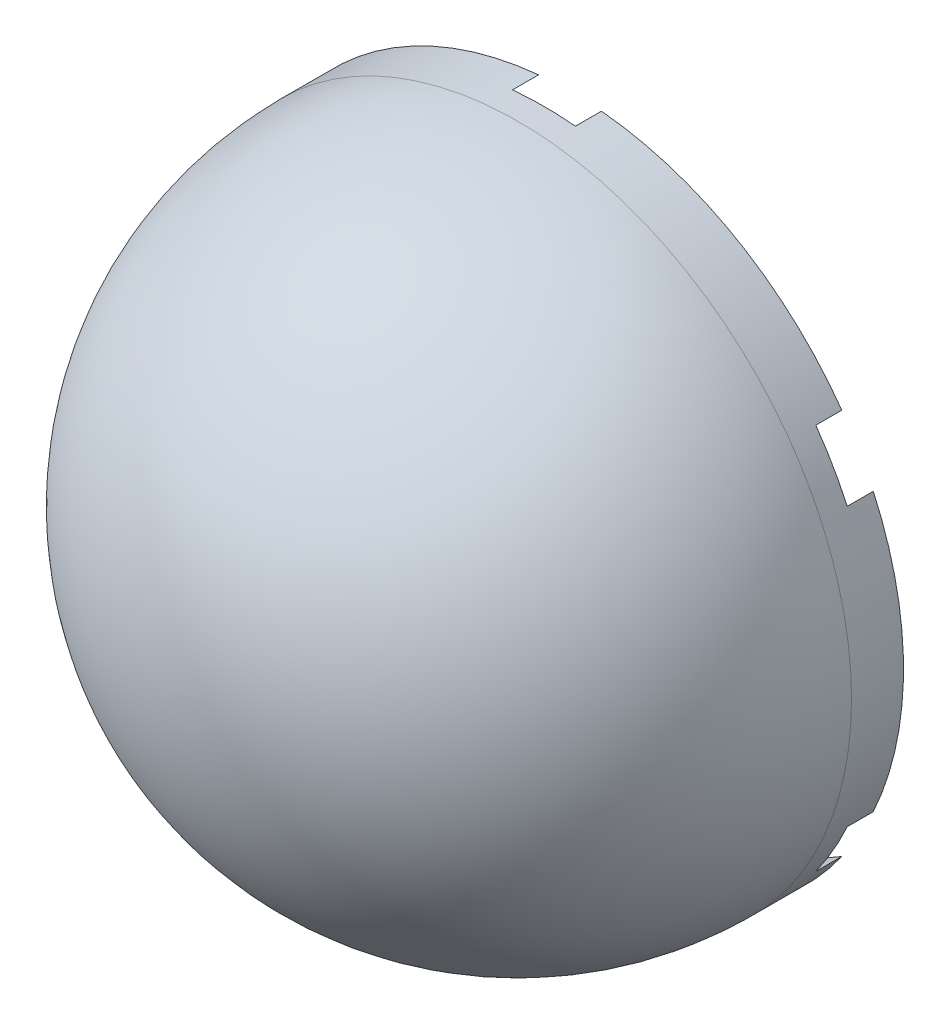
ISO-10303-21;
HEADER;
FILE_DESCRIPTION(('STEP AP214'),'2;1');
FILE_NAME('part.step','',(''),(''),'','','');
FILE_SCHEMA(('AUTOMOTIVE_DESIGN { 1 0 10303 214 1 1 1 1 }'));
ENDSEC;
DATA;
#1=APPLICATION_CONTEXT('core data for automotive mechanical design processes');
#2=APPLICATION_PROTOCOL_DEFINITION('international standard','automotive_design',2000,#1);
#3=PRODUCT_CONTEXT('',#1,'mechanical');
#4=PRODUCT('Part','Part','',(#3));
#5=PRODUCT_RELATED_PRODUCT_CATEGORY('part','',(#4));
#6=PRODUCT_DEFINITION_FORMATION('','',#4);
#7=PRODUCT_DEFINITION_CONTEXT('part definition',#1,'design');
#8=PRODUCT_DEFINITION('design','',#6,#7);
#9=PRODUCT_DEFINITION_SHAPE('','',#8);
#10=(LENGTH_UNIT() NAMED_UNIT(*) SI_UNIT(.MILLI.,.METRE.));
#11=(NAMED_UNIT(*) PLANE_ANGLE_UNIT() SI_UNIT($,.RADIAN.));
#12=(NAMED_UNIT(*) SI_UNIT($,.STERADIAN.) SOLID_ANGLE_UNIT());
#13=UNCERTAINTY_MEASURE_WITH_UNIT(LENGTH_MEASURE(1.E-05),#10,'distance_accuracy_value','');
#14=(GEOMETRIC_REPRESENTATION_CONTEXT(3) GLOBAL_UNCERTAINTY_ASSIGNED_CONTEXT((#13)) GLOBAL_UNIT_ASSIGNED_CONTEXT((#10,
#11,#12)) REPRESENTATION_CONTEXT('',''));
#15=CARTESIAN_POINT('',(0.,0.,0.));
#16=DIRECTION('',(0.,0.,1.));
#17=DIRECTION('',(1.,0.,0.));
#18=AXIS2_PLACEMENT_3D('',#15,#16,#17);
#19=CARTESIAN_POINT('',(-69.634967563167,5.39430382459221,48.6));
#20=DIRECTION('',(0.,0.,1.));
#21=DIRECTION('',(1.,0.,0.));
#22=AXIS2_PLACEMENT_3D('',#19,#20,#21);
#23=PLANE('',#22);
#24=CARTESIAN_POINT('',(-69.634967563167,5.39430382459221,48.6));
#25=DIRECTION('',(0.,0.,1.));
#26=DIRECTION('',(1.,0.,0.));
#27=AXIS2_PLACEMENT_3D('',#24,#25,#26);
#28=CIRCLE('',#27,11.5470053837925);
#29=CARTESIAN_POINT('',(-70.7241383188938,16.8898264485621,48.6));
#30=VERTEX_POINT('',#29);
#31=CARTESIAN_POINT('',(-79.0457968074403,12.0853146800956,48.6));
#32=VERTEX_POINT('',#31);
#33=EDGE_CURVE('E133',#30,#32,#28,.T.);
#34=ORIENTED_EDGE('',*,*,#33,.F.);
#35=DIRECTION('',(0.866025403784439,0.499999999999999,0.));
#36=VECTOR('',#35,1.);
#37=CARTESIAN_POINT('',(-80.134967563167,11.4564816510833,48.6));
#38=LINE('',#37,#36);
#39=EDGE_CURVE('E124',#32,#30,#38,.T.);
#40=ORIENTED_EDGE('',*,*,#39,.F.);
#41=EDGE_LOOP('',(#34,#40));
#42=FACE_BOUND('',#41,.T.);
#43=ADVANCED_FACE('F33',(#42),#23,.F.);
#44=CARTESIAN_POINT('',(-80.134967563167,10.1988155930587,48.6));
#45=VERTEX_POINT('',#44);
#46=CARTESIAN_POINT('',(-80.134967563167,0.589792056125666,48.6));
#47=VERTEX_POINT('',#46);
#48=EDGE_CURVE('E140',#45,#47,#28,.T.);
#49=ORIENTED_EDGE('',*,*,#48,.F.);
#50=DIRECTION('',(0.,1.,0.));
#51=VECTOR('',#50,1.);
#52=CARTESIAN_POINT('',(-80.134967563167,-0.66787400189888,48.6));
#53=LINE('',#52,#51);
#54=EDGE_CURVE('E215',#47,#45,#53,.T.);
#55=ORIENTED_EDGE('',*,*,#54,.F.);
#56=EDGE_LOOP('',(#49,#55));
#57=FACE_BOUND('',#56,.T.);
#58=ADVANCED_FACE('F244',(#57),#23,.F.);
#59=CARTESIAN_POINT('',(-79.0457968074403,-1.29670703091116,48.6));
#60=VERTEX_POINT('',#59);
#61=CARTESIAN_POINT('',(-70.7241383188937,-6.10121879937765,48.6));
#62=VERTEX_POINT('',#61);
#63=EDGE_CURVE('E146',#60,#62,#28,.T.);
#64=ORIENTED_EDGE('',*,*,#63,.F.);
#65=DIRECTION('',(-0.866025403784439,0.5,0.));
#66=VECTOR('',#65,1.);
#67=CARTESIAN_POINT('',(-69.634967563167,-6.73005182838994,48.6));
#68=LINE('',#67,#66);
#69=EDGE_CURVE('E212',#62,#60,#68,.T.);
#70=ORIENTED_EDGE('',*,*,#69,.F.);
#71=EDGE_LOOP('',(#64,#70));
#72=FACE_BOUND('',#71,.T.);
#73=ADVANCED_FACE('F249',(#72),#23,.F.);
#74=CARTESIAN_POINT('',(-68.5457968074403,-6.10121879937765,48.6));
#75=VERTEX_POINT('',#74);
#76=CARTESIAN_POINT('',(-60.2241383188938,-1.29670703091118,48.6));
#77=VERTEX_POINT('',#76);
#78=EDGE_CURVE('E150',#75,#77,#28,.T.);
#79=ORIENTED_EDGE('',*,*,#78,.F.);
#80=DIRECTION('',(-0.866025403784439,-0.5,0.));
#81=VECTOR('',#80,1.);
#82=CARTESIAN_POINT('',(-59.134967563167,-0.667874001898872,48.6));
#83=LINE('',#82,#81);
#84=EDGE_CURVE('E210',#77,#75,#83,.T.);
#85=ORIENTED_EDGE('',*,*,#84,.F.);
#86=EDGE_LOOP('',(#79,#85));
#87=FACE_BOUND('',#86,.T.);
#88=ADVANCED_FACE('F209',(#87),#23,.F.);
#89=CARTESIAN_POINT('',(-59.134967563167,0.589792056125739,48.6));
#90=VERTEX_POINT('',#89);
#91=CARTESIAN_POINT('',(-59.134967563167,10.1988155930587,48.6));
#92=VERTEX_POINT('',#91);
#93=EDGE_CURVE('E144',#90,#92,#28,.T.);
#94=ORIENTED_EDGE('',*,*,#93,.F.);
#95=DIRECTION('',(0.,-1.,0.));
#96=VECTOR('',#95,1.);
#97=CARTESIAN_POINT('',(-59.134967563167,11.4564816510833,48.6));
#98=LINE('',#97,#96);
#99=EDGE_CURVE('E213',#92,#90,#98,.T.);
#100=ORIENTED_EDGE('',*,*,#99,.F.);
#101=EDGE_LOOP('',(#94,#100));
#102=FACE_BOUND('',#101,.T.);
#103=ADVANCED_FACE('F234',(#102),#23,.F.);
#104=CARTESIAN_POINT('',(-60.2241383188938,12.0853146800956,48.6));
#105=VERTEX_POINT('',#104);
#106=CARTESIAN_POINT('',(-68.5457968074403,16.8898264485621,48.6));
#107=VERTEX_POINT('',#106);
#108=EDGE_CURVE('E139',#105,#107,#28,.T.);
#109=ORIENTED_EDGE('',*,*,#108,.F.);
#110=DIRECTION('',(0.866025403784439,-0.5,0.));
#111=VECTOR('',#110,1.);
#112=CARTESIAN_POINT('',(-69.634967563167,17.5186594775744,48.6));
#113=LINE('',#112,#111);
#114=EDGE_CURVE('E134',#107,#105,#113,.T.);
#115=ORIENTED_EDGE('',*,*,#114,.F.);
#116=EDGE_LOOP('',(#109,#115));
#117=FACE_BOUND('',#116,.T.);
#118=ADVANCED_FACE('F232',(#117),#23,.F.);
#119=CARTESIAN_POINT('',(-69.634967563167,5.39430382459221,50.4));
#120=DIRECTION('',(0.,0.,-1.));
#121=DIRECTION('',(-1.,0.,0.));
#122=AXIS2_PLACEMENT_3D('',#119,#120,#121);
#123=CYLINDRICAL_SURFACE('',#122,11.5470053837925);
#124=ORIENTED_EDGE('',*,*,#33,.T.);
#125=DIRECTION('',(0.,0.,-1.));
#126=VECTOR('',#125,1.);
#127=CARTESIAN_POINT('',(-79.0457968074403,12.0853146800956,50.4));
#128=LINE('',#127,#126);
#129=CARTESIAN_POINT('',(-79.0457968074403,12.0853146800956,49.5));
#130=VERTEX_POINT('',#129);
#131=EDGE_CURVE('E11',#32,#130,#128,.F.);
#132=ORIENTED_EDGE('',*,*,#131,.T.);
#133=CARTESIAN_POINT('',(-69.634967563167,5.39430382459221,49.5));
#134=DIRECTION('',(0.,0.,-1.));
#135=DIRECTION('',(-1.,0.,0.));
#136=AXIS2_PLACEMENT_3D('',#133,#134,#135);
#137=CIRCLE('',#136,11.5470053837925);
#138=CARTESIAN_POINT('',(-80.134967563167,10.1988155930587,49.5));
#139=VERTEX_POINT('',#138);
#140=EDGE_CURVE('E156',#139,#130,#137,.T.);
#141=ORIENTED_EDGE('',*,*,#140,.F.);
#142=DIRECTION('',(0.,0.,-1.));
#143=VECTOR('',#142,1.);
#144=CARTESIAN_POINT('',(-80.134967563167,10.1988155930587,50.4));
#145=LINE('',#144,#143);
#146=EDGE_CURVE('E41',#139,#45,#145,.T.);
#147=ORIENTED_EDGE('',*,*,#146,.T.);
#148=ORIENTED_EDGE('',*,*,#48,.T.);
#149=DIRECTION('',(0.,0.,-1.));
#150=VECTOR('',#149,1.);
#151=CARTESIAN_POINT('',(-80.134967563167,0.589792056125684,50.4));
#152=LINE('',#151,#150);
#153=CARTESIAN_POINT('',(-80.134967563167,0.589792056125666,49.5));
#154=VERTEX_POINT('',#153);
#155=EDGE_CURVE('E160',#47,#154,#152,.F.);
#156=ORIENTED_EDGE('',*,*,#155,.T.);
#157=CARTESIAN_POINT('',(-79.0457968074403,-1.29670703091116,49.5));
#158=VERTEX_POINT('',#157);
#159=EDGE_CURVE('E153',#158,#154,#137,.T.);
#160=ORIENTED_EDGE('',*,*,#159,.F.);
#161=DIRECTION('',(0.,0.,-1.));
#162=VECTOR('',#161,1.);
#163=CARTESIAN_POINT('',(-79.0457968074403,-1.29670703091117,50.4));
#164=LINE('',#163,#162);
#165=EDGE_CURVE('E155',#158,#60,#164,.T.);
#166=ORIENTED_EDGE('',*,*,#165,.T.);
#167=ORIENTED_EDGE('',*,*,#63,.T.);
#168=DIRECTION('',(0.,0.,-1.));
#169=VECTOR('',#168,1.);
#170=CARTESIAN_POINT('',(-70.7241383188938,-6.10121879937765,50.4));
#171=LINE('',#170,#169);
#172=CARTESIAN_POINT('',(-70.7241383188937,-6.10121879937765,49.5));
#173=VERTEX_POINT('',#172);
#174=EDGE_CURVE('E166',#62,#173,#171,.F.);
#175=ORIENTED_EDGE('',*,*,#174,.T.);
#176=CARTESIAN_POINT('',(-68.5457968074403,-6.10121879937765,49.5));
#177=VERTEX_POINT('',#176);
#178=EDGE_CURVE('E157',#177,#173,#137,.T.);
#179=ORIENTED_EDGE('',*,*,#178,.F.);
#180=DIRECTION('',(0.,0.,-1.));
#181=VECTOR('',#180,1.);
#182=CARTESIAN_POINT('',(-68.5457968074403,-6.10121879937765,50.4));
#183=LINE('',#182,#181);
#184=EDGE_CURVE('E163',#177,#75,#183,.T.);
#185=ORIENTED_EDGE('',*,*,#184,.T.);
#186=ORIENTED_EDGE('',*,*,#78,.T.);
#187=DIRECTION('',(0.,0.,-1.));
#188=VECTOR('',#187,1.);
#189=CARTESIAN_POINT('',(-60.2241383188938,-1.29670703091117,50.4));
#190=LINE('',#189,#188);
#191=CARTESIAN_POINT('',(-60.2241383188938,-1.29670703091118,49.5));
#192=VERTEX_POINT('',#191);
#193=EDGE_CURVE('E173',#77,#192,#190,.F.);
#194=ORIENTED_EDGE('',*,*,#193,.T.);
#195=CARTESIAN_POINT('',(-59.134967563167,0.589792056125739,49.5));
#196=VERTEX_POINT('',#195);
#197=EDGE_CURVE('E169',#196,#192,#137,.T.);
#198=ORIENTED_EDGE('',*,*,#197,.F.);
#199=DIRECTION('',(0.,0.,-1.));
#200=VECTOR('',#199,1.);
#201=CARTESIAN_POINT('',(-59.134967563167,0.589792056125741,50.4));
#202=LINE('',#201,#200);
#203=EDGE_CURVE('E170',#196,#90,#202,.T.);
#204=ORIENTED_EDGE('',*,*,#203,.T.);
#205=ORIENTED_EDGE('',*,*,#93,.T.);
#206=DIRECTION('',(0.,0.,-1.));
#207=VECTOR('',#206,1.);
#208=CARTESIAN_POINT('',(-59.134967563167,10.1988155930587,50.4));
#209=LINE('',#208,#207);
#210=CARTESIAN_POINT('',(-59.134967563167,10.1988155930587,49.5));
#211=VERTEX_POINT('',#210);
#212=EDGE_CURVE('E178',#92,#211,#209,.F.);
#213=ORIENTED_EDGE('',*,*,#212,.T.);
#214=CARTESIAN_POINT('',(-60.2241383188938,12.0853146800956,49.5));
#215=VERTEX_POINT('',#214);
#216=EDGE_CURVE('E176',#215,#211,#137,.T.);
#217=ORIENTED_EDGE('',*,*,#216,.F.);
#218=DIRECTION('',(0.,0.,-1.));
#219=VECTOR('',#218,1.);
#220=CARTESIAN_POINT('',(-60.2241383188937,12.0853146800956,50.4));
#221=LINE('',#220,#219);
#222=EDGE_CURVE('E56',#215,#105,#221,.T.);
#223=ORIENTED_EDGE('',*,*,#222,.T.);
#224=ORIENTED_EDGE('',*,*,#108,.T.);
#225=DIRECTION('',(0.,0.,-1.));
#226=VECTOR('',#225,1.);
#227=CARTESIAN_POINT('',(-68.5457968074403,16.8898264485621,50.4));
#228=LINE('',#227,#226);
#229=CARTESIAN_POINT('',(-68.5457968074403,16.8898264485621,49.5));
#230=VERTEX_POINT('',#229);
#231=EDGE_CURVE('E182',#107,#230,#228,.F.);
#232=ORIENTED_EDGE('',*,*,#231,.T.);
#233=CARTESIAN_POINT('',(-70.7241383188938,16.8898264485621,49.5));
#234=VERTEX_POINT('',#233);
#235=EDGE_CURVE('E181',#234,#230,#137,.T.);
#236=ORIENTED_EDGE('',*,*,#235,.F.);
#237=DIRECTION('',(0.,0.,-1.));
#238=VECTOR('',#237,1.);
#239=CARTESIAN_POINT('',(-70.7241383188938,16.8898264485621,50.4));
#240=LINE('',#239,#238);
#241=EDGE_CURVE('E138',#234,#30,#240,.T.);
#242=ORIENTED_EDGE('',*,*,#241,.T.);
#243=EDGE_LOOP('',(#124,#132,#141,#147,#148,#156,#160,#166,#167,#175,#179,#185,#186,#194,#198,
#204,#205,#213,#217,#223,#224,#232,#236,#242));
#244=FACE_BOUND('',#243,.T.);
#245=CARTESIAN_POINT('',(-69.634967563167,5.39430382459221,50.4));
#246=DIRECTION('',(0.,0.,1.));
#247=DIRECTION('',(1.,0.,0.));
#248=AXIS2_PLACEMENT_3D('',#245,#246,#247);
#249=CIRCLE('',#248,11.5470053837925);
#250=CARTESIAN_POINT('',(-58.0879621793745,5.39430382459221,50.4));
#251=VERTEX_POINT('',#250);
#252=EDGE_CURVE('E143',#251,#251,#249,.T.);
#253=ORIENTED_EDGE('',*,*,#252,.F.);
#254=EDGE_LOOP('',(#253));
#255=FACE_BOUND('',#254,.T.);
#256=ADVANCED_FACE('F35',(#244,#255),#123,.T.);
#257=CARTESIAN_POINT('',(-69.634967563167,5.39430382459221,50.4));
#258=DIRECTION('',(0.,0.,-1.));
#259=DIRECTION('',(0.,-1.,0.));
#260=AXIS2_PLACEMENT_3D('',#257,#258,#259);
#261=SPHERICAL_SURFACE('',#260,11.5470053837925);
#262=ORIENTED_EDGE('',*,*,#252,.T.);
#263=EDGE_LOOP('',(#262));
#264=FACE_BOUND('',#263,.T.);
#265=ADVANCED_FACE('F240',(#264),#261,.T.);
#266=CARTESIAN_POINT('',(-80.134967563167,11.4564816510833,49.5));
#267=DIRECTION('',(-0.499999999999999,0.866025403784439,0.));
#268=DIRECTION('',(-0.866025403784439,-0.499999999999999,0.));
#269=AXIS2_PLACEMENT_3D('',#266,#267,#268);
#270=PLANE('',#269);
#271=DIRECTION('',(0.866025403784439,0.499999999999999,0.));
#272=VECTOR('',#271,1.);
#273=CARTESIAN_POINT('',(-80.134967563167,11.4564816510833,49.5));
#274=LINE('',#273,#272);
#275=EDGE_CURVE('E127',#130,#234,#274,.T.);
#276=ORIENTED_EDGE('',*,*,#275,.F.);
#277=ORIENTED_EDGE('',*,*,#131,.F.);
#278=ORIENTED_EDGE('',*,*,#39,.T.);
#279=ORIENTED_EDGE('',*,*,#241,.F.);
#280=EDGE_LOOP('',(#276,#277,#278,#279));
#281=FACE_BOUND('',#280,.T.);
#282=ADVANCED_FACE('F123',(#281),#270,.F.);
#283=CARTESIAN_POINT('',(-80.134967563167,-0.66787400189888,49.5));
#284=DIRECTION('',(-1.,0.,0.));
#285=DIRECTION('',(0.,-1.,0.));
#286=AXIS2_PLACEMENT_3D('',#283,#284,#285);
#287=PLANE('',#286);
#288=DIRECTION('',(0.,1.,0.));
#289=VECTOR('',#288,1.);
#290=CARTESIAN_POINT('',(-80.134967563167,-0.66787400189888,49.5));
#291=LINE('',#290,#289);
#292=EDGE_CURVE('E151',#154,#139,#291,.T.);
#293=ORIENTED_EDGE('',*,*,#292,.F.);
#294=ORIENTED_EDGE('',*,*,#155,.F.);
#295=ORIENTED_EDGE('',*,*,#54,.T.);
#296=ORIENTED_EDGE('',*,*,#146,.F.);
#297=EDGE_LOOP('',(#293,#294,#295,#296));
#298=FACE_BOUND('',#297,.T.);
#299=ADVANCED_FACE('F255',(#298),#287,.F.);
#300=CARTESIAN_POINT('',(-69.634967563167,-6.73005182838994,49.5));
#301=DIRECTION('',(-0.5,-0.866025403784439,0.));
#302=DIRECTION('',(0.866025403784439,-0.5,0.));
#303=AXIS2_PLACEMENT_3D('',#300,#301,#302);
#304=PLANE('',#303);
#305=DIRECTION('',(-0.866025403784439,0.5,0.));
#306=VECTOR('',#305,1.);
#307=CARTESIAN_POINT('',(-69.634967563167,-6.73005182838994,49.5));
#308=LINE('',#307,#306);
#309=EDGE_CURVE('E48',#173,#158,#308,.T.);
#310=ORIENTED_EDGE('',*,*,#309,.F.);
#311=ORIENTED_EDGE('',*,*,#174,.F.);
#312=ORIENTED_EDGE('',*,*,#69,.T.);
#313=ORIENTED_EDGE('',*,*,#165,.F.);
#314=EDGE_LOOP('',(#310,#311,#312,#313));
#315=FACE_BOUND('',#314,.T.);
#316=ADVANCED_FACE('F198',(#315),#304,.F.);
#317=CARTESIAN_POINT('',(-59.134967563167,-0.667874001898872,49.5));
#318=DIRECTION('',(0.5,-0.866025403784438,0.));
#319=DIRECTION('',(0.866025403784439,0.5,0.));
#320=AXIS2_PLACEMENT_3D('',#317,#318,#319);
#321=PLANE('',#320);
#322=DIRECTION('',(-0.866025403784439,-0.5,0.));
#323=VECTOR('',#322,1.);
#324=CARTESIAN_POINT('',(-59.134967563167,-0.667874001898872,49.5));
#325=LINE('',#324,#323);
#326=EDGE_CURVE('E196',#192,#177,#325,.T.);
#327=ORIENTED_EDGE('',*,*,#326,.F.);
#328=ORIENTED_EDGE('',*,*,#193,.F.);
#329=ORIENTED_EDGE('',*,*,#84,.T.);
#330=ORIENTED_EDGE('',*,*,#184,.F.);
#331=EDGE_LOOP('',(#327,#328,#329,#330));
#332=FACE_BOUND('',#331,.T.);
#333=ADVANCED_FACE('F261',(#332),#321,.F.);
#334=CARTESIAN_POINT('',(-59.134967563167,11.4564816510833,49.5));
#335=DIRECTION('',(1.,0.,0.));
#336=DIRECTION('',(0.,0.,-1.));
#337=AXIS2_PLACEMENT_3D('',#334,#335,#336);
#338=PLANE('',#337);
#339=DIRECTION('',(0.,-1.,0.));
#340=VECTOR('',#339,1.);
#341=CARTESIAN_POINT('',(-59.134967563167,11.4564816510833,49.5));
#342=LINE('',#341,#340);
#343=EDGE_CURVE('E223',#211,#196,#342,.T.);
#344=ORIENTED_EDGE('',*,*,#343,.F.);
#345=ORIENTED_EDGE('',*,*,#212,.F.);
#346=ORIENTED_EDGE('',*,*,#99,.T.);
#347=ORIENTED_EDGE('',*,*,#203,.F.);
#348=EDGE_LOOP('',(#344,#345,#346,#347));
#349=FACE_BOUND('',#348,.T.);
#350=ADVANCED_FACE('F268',(#349),#338,.F.);
#351=CARTESIAN_POINT('',(-69.634967563167,17.5186594775744,49.5));
#352=DIRECTION('',(0.5,0.866025403784439,0.));
#353=DIRECTION('',(-0.866025403784439,0.5,0.));
#354=AXIS2_PLACEMENT_3D('',#351,#352,#353);
#355=PLANE('',#354);
#356=DIRECTION('',(0.866025403784439,-0.5,0.));
#357=VECTOR('',#356,1.);
#358=CARTESIAN_POINT('',(-69.634967563167,17.5186594775744,49.5));
#359=LINE('',#358,#357);
#360=EDGE_CURVE('E221',#230,#215,#359,.T.);
#361=ORIENTED_EDGE('',*,*,#360,.F.);
#362=ORIENTED_EDGE('',*,*,#231,.F.);
#363=ORIENTED_EDGE('',*,*,#114,.T.);
#364=ORIENTED_EDGE('',*,*,#222,.F.);
#365=EDGE_LOOP('',(#361,#362,#363,#364));
#366=FACE_BOUND('',#365,.T.);
#367=ADVANCED_FACE('F229',(#366),#355,.F.);
#368=CARTESIAN_POINT('',(0.,0.,49.5));
#369=DIRECTION('',(0.,0.,-1.));
#370=DIRECTION('',(-1.,0.,0.));
#371=AXIS2_PLACEMENT_3D('',#368,#369,#370);
#372=PLANE('',#371);
#373=ORIENTED_EDGE('',*,*,#140,.T.);
#374=ORIENTED_EDGE('',*,*,#275,.T.);
#375=ORIENTED_EDGE('',*,*,#235,.T.);
#376=ORIENTED_EDGE('',*,*,#360,.T.);
#377=ORIENTED_EDGE('',*,*,#216,.T.);
#378=ORIENTED_EDGE('',*,*,#343,.T.);
#379=ORIENTED_EDGE('',*,*,#197,.T.);
#380=ORIENTED_EDGE('',*,*,#326,.T.);
#381=ORIENTED_EDGE('',*,*,#178,.T.);
#382=ORIENTED_EDGE('',*,*,#309,.T.);
#383=ORIENTED_EDGE('',*,*,#159,.T.);
#384=ORIENTED_EDGE('',*,*,#292,.T.);
#385=EDGE_LOOP('',(#373,#374,#375,#376,#377,#378,#379,#380,#381,#382,#383,#384));
#386=FACE_BOUND('',#385,.T.);
#387=ADVANCED_FACE('F195',(#386),#372,.T.);
#388=CLOSED_SHELL('',(#43,#58,#73,#88,#103,#118,#256,#265,#282,#299,#316,#333,#350,#367,#387));
#389=MANIFOLD_SOLID_BREP('B2',#388);
#390=ADVANCED_BREP_SHAPE_REPRESENTATION('',(#18,#389),#14);
#391=SHAPE_DEFINITION_REPRESENTATION(#9,#390);
ENDSEC;
END-ISO-10303-21;
